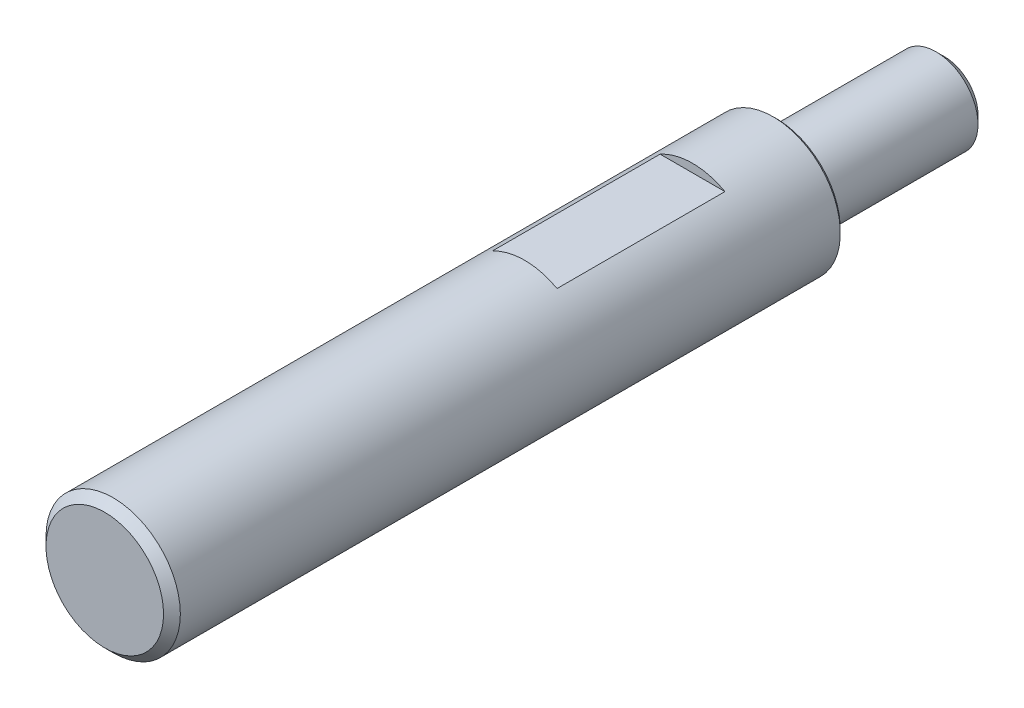
ISO-10303-21;
HEADER;
FILE_DESCRIPTION(('STEP AP214'),'2;1');
FILE_NAME('part.step','',(''),(''),'','','');
FILE_SCHEMA(('AUTOMOTIVE_DESIGN { 1 0 10303 214 1 1 1 1 }'));
ENDSEC;
DATA;
#1=APPLICATION_CONTEXT('core data for automotive mechanical design processes');
#2=APPLICATION_PROTOCOL_DEFINITION('international standard','automotive_design',2000,#1);
#3=PRODUCT_CONTEXT('',#1,'mechanical');
#4=PRODUCT('Part','Part','',(#3));
#5=PRODUCT_RELATED_PRODUCT_CATEGORY('part','',(#4));
#6=PRODUCT_DEFINITION_FORMATION('','',#4);
#7=PRODUCT_DEFINITION_CONTEXT('part definition',#1,'design');
#8=PRODUCT_DEFINITION('design','',#6,#7);
#9=PRODUCT_DEFINITION_SHAPE('','',#8);
#10=(LENGTH_UNIT() NAMED_UNIT(*) SI_UNIT(.MILLI.,.METRE.));
#11=(NAMED_UNIT(*) PLANE_ANGLE_UNIT() SI_UNIT($,.RADIAN.));
#12=(NAMED_UNIT(*) SI_UNIT($,.STERADIAN.) SOLID_ANGLE_UNIT());
#13=UNCERTAINTY_MEASURE_WITH_UNIT(LENGTH_MEASURE(1.E-05),#10,'distance_accuracy_value','');
#14=(GEOMETRIC_REPRESENTATION_CONTEXT(3) GLOBAL_UNCERTAINTY_ASSIGNED_CONTEXT((#13)) GLOBAL_UNIT_ASSIGNED_CONTEXT((#10,
#11,#12)) REPRESENTATION_CONTEXT('',''));
#15=CARTESIAN_POINT('',(0.,0.,0.));
#16=DIRECTION('',(0.,0.,1.));
#17=DIRECTION('',(1.,0.,0.));
#18=AXIS2_PLACEMENT_3D('',#15,#16,#17);
#19=CARTESIAN_POINT('',(0.,0.,25.));
#20=DIRECTION('',(0.,0.,-1.));
#21=DIRECTION('',(-1.,0.,0.));
#22=AXIS2_PLACEMENT_3D('',#19,#20,#21);
#23=CYLINDRICAL_SURFACE('',#22,4.);
#24=CARTESIAN_POINT('',(0.,0.,24.5));
#25=DIRECTION('',(0.,0.,1.));
#26=DIRECTION('',(1.,0.,0.));
#27=AXIS2_PLACEMENT_3D('',#24,#25,#26);
#28=CIRCLE('',#27,4.);
#29=CARTESIAN_POINT('',(4.,0.,24.5));
#30=VERTEX_POINT('',#29);
#31=EDGE_CURVE('E11',#30,#30,#28,.F.);
#32=ORIENTED_EDGE('',*,*,#31,.T.);
#33=EDGE_LOOP('',(#32));
#34=FACE_BOUND('',#33,.T.);
#35=DIRECTION('',(0.,0.,-1.));
#36=VECTOR('',#35,1.);
#37=CARTESIAN_POINT('',(1.94150366114404,-3.49722225970331,25.));
#38=LINE('',#37,#36);
#39=CARTESIAN_POINT('',(1.94150366114404,-3.49722225970331,0.));
#40=VERTEX_POINT('',#39);
#41=CARTESIAN_POINT('',(1.94150366114404,-3.49722225970331,-10.));
#42=VERTEX_POINT('',#41);
#43=EDGE_CURVE('E87',#40,#42,#38,.T.);
#44=ORIENTED_EDGE('',*,*,#43,.T.);
#45=CARTESIAN_POINT('',(0.,0.,-10.));
#46=DIRECTION('',(0.,0.,-1.));
#47=DIRECTION('',(-1.,0.,0.));
#48=AXIS2_PLACEMENT_3D('',#45,#46,#47);
#49=CIRCLE('',#48,4.);
#50=CARTESIAN_POINT('',(-1.94150366114404,-3.49722225970331,-10.));
#51=VERTEX_POINT('',#50);
#52=EDGE_CURVE('E75',#42,#51,#49,.T.);
#53=ORIENTED_EDGE('',*,*,#52,.T.);
#54=DIRECTION('',(0.,0.,-1.));
#55=VECTOR('',#54,1.);
#56=CARTESIAN_POINT('',(-1.94150366114404,-3.49722225970331,25.));
#57=LINE('',#56,#55);
#58=CARTESIAN_POINT('',(-1.94150366114404,-3.49722225970331,0.));
#59=VERTEX_POINT('',#58);
#60=EDGE_CURVE('E80',#51,#59,#57,.F.);
#61=ORIENTED_EDGE('',*,*,#60,.T.);
#62=CARTESIAN_POINT('',(0.,0.,0.));
#63=DIRECTION('',(0.,0.,1.));
#64=DIRECTION('',(0.,-1.,0.));
#65=AXIS2_PLACEMENT_3D('',#62,#63,#64);
#66=CIRCLE('',#65,4.);
#67=EDGE_CURVE('E92',#59,#40,#66,.T.);
#68=ORIENTED_EDGE('',*,*,#67,.T.);
#69=EDGE_LOOP('',(#44,#53,#61,#68));
#70=FACE_BOUND('',#69,.T.);
#71=CARTESIAN_POINT('',(0.,0.,0.));
#72=DIRECTION('',(0.,0.,1.));
#73=DIRECTION('',(0.,-1.,0.));
#74=AXIS2_PLACEMENT_3D('',#71,#72,#73);
#75=CIRCLE('',#74,4.);
#76=CARTESIAN_POINT('',(1.93146268462064,3.50277774029669,0.));
#77=VERTEX_POINT('',#76);
#78=CARTESIAN_POINT('',(-1.93146268462064,3.50277774029669,0.));
#79=VERTEX_POINT('',#78);
#80=EDGE_CURVE('E100',#77,#79,#75,.T.);
#81=ORIENTED_EDGE('',*,*,#80,.T.);
#82=DIRECTION('',(0.,0.,-1.));
#83=VECTOR('',#82,1.);
#84=CARTESIAN_POINT('',(-1.93146268462064,3.50277774029669,25.));
#85=LINE('',#84,#83);
#86=CARTESIAN_POINT('',(-1.93146268462064,3.50277774029669,-10.));
#87=VERTEX_POINT('',#86);
#88=EDGE_CURVE('E81',#79,#87,#85,.T.);
#89=ORIENTED_EDGE('',*,*,#88,.T.);
#90=CARTESIAN_POINT('',(0.,0.,-10.));
#91=DIRECTION('',(0.,0.,-1.));
#92=DIRECTION('',(-1.,0.,0.));
#93=AXIS2_PLACEMENT_3D('',#90,#91,#92);
#94=CIRCLE('',#93,4.);
#95=CARTESIAN_POINT('',(1.93146268462064,3.50277774029669,-10.));
#96=VERTEX_POINT('',#95);
#97=EDGE_CURVE('E103',#87,#96,#94,.T.);
#98=ORIENTED_EDGE('',*,*,#97,.T.);
#99=DIRECTION('',(0.,0.,-1.));
#100=VECTOR('',#99,1.);
#101=CARTESIAN_POINT('',(1.93146268462064,3.50277774029669,25.));
#102=LINE('',#101,#100);
#103=EDGE_CURVE('E106',#96,#77,#102,.F.);
#104=ORIENTED_EDGE('',*,*,#103,.T.);
#105=EDGE_LOOP('',(#81,#89,#98,#104));
#106=FACE_BOUND('',#105,.T.);
#107=CARTESIAN_POINT('',(0.,0.,-14.8));
#108=DIRECTION('',(0.,0.,-1.));
#109=DIRECTION('',(-1.,0.,0.));
#110=AXIS2_PLACEMENT_3D('',#107,#108,#109);
#111=CIRCLE('',#110,4.);
#112=CARTESIAN_POINT('',(-4.,0.,-14.8));
#113=VERTEX_POINT('',#112);
#114=EDGE_CURVE('E109',#113,#113,#111,.F.);
#115=ORIENTED_EDGE('',*,*,#114,.T.);
#116=EDGE_LOOP('',(#115));
#117=FACE_BOUND('',#116,.T.);
#118=ADVANCED_FACE('F36',(#34,#70,#106,#117),#23,.T.);
#119=CARTESIAN_POINT('',(0.,0.,25.));
#120=DIRECTION('',(0.,0.,1.));
#121=DIRECTION('',(1.,0.,0.));
#122=AXIS2_PLACEMENT_3D('',#119,#120,#121);
#123=PLANE('',#122);
#124=CARTESIAN_POINT('',(0.,0.,25.));
#125=DIRECTION('',(0.,0.,1.));
#126=DIRECTION('',(1.,0.,0.));
#127=AXIS2_PLACEMENT_3D('',#124,#125,#126);
#128=CIRCLE('',#127,3.49999999999999);
#129=CARTESIAN_POINT('',(3.49999999999999,0.,25.));
#130=VERTEX_POINT('',#129);
#131=EDGE_CURVE('E44',#130,#130,#128,.T.);
#132=ORIENTED_EDGE('',*,*,#131,.T.);
#133=EDGE_LOOP('',(#132));
#134=FACE_BOUND('',#133,.T.);
#135=ADVANCED_FACE('F143',(#134),#123,.T.);
#136=CARTESIAN_POINT('',(0.,0.,-15.));
#137=DIRECTION('',(0.,0.,-1.));
#138=DIRECTION('',(-1.,0.,0.));
#139=AXIS2_PLACEMENT_3D('',#136,#137,#138);
#140=PLANE('',#139);
#141=CARTESIAN_POINT('',(0.,0.,-15.));
#142=DIRECTION('',(0.,0.,-1.));
#143=DIRECTION('',(-1.,0.,0.));
#144=AXIS2_PLACEMENT_3D('',#141,#142,#143);
#145=CIRCLE('',#144,3.8);
#146=CARTESIAN_POINT('',(-3.8,0.,-15.));
#147=VERTEX_POINT('',#146);
#148=EDGE_CURVE('E112',#147,#147,#145,.T.);
#149=ORIENTED_EDGE('',*,*,#148,.T.);
#150=EDGE_LOOP('',(#149));
#151=FACE_BOUND('',#150,.T.);
#152=CARTESIAN_POINT('',(0.,0.,-15.));
#153=DIRECTION('',(0.,0.,-1.));
#154=DIRECTION('',(-1.,0.,0.));
#155=AXIS2_PLACEMENT_3D('',#152,#153,#154);
#156=CIRCLE('',#155,2.5);
#157=CARTESIAN_POINT('',(-2.5,0.,-15.));
#158=VERTEX_POINT('',#157);
#159=EDGE_CURVE('E121',#158,#158,#156,.T.);
#160=ORIENTED_EDGE('',*,*,#159,.F.);
#161=EDGE_LOOP('',(#160));
#162=FACE_BOUND('',#161,.T.);
#163=ADVANCED_FACE('F149',(#151,#162),#140,.T.);
#164=CARTESIAN_POINT('',(0.,0.,-15.));
#165=DIRECTION('',(0.,0.,-1.));
#166=DIRECTION('',(-1.,0.,0.));
#167=AXIS2_PLACEMENT_3D('',#164,#165,#166);
#168=CYLINDRICAL_SURFACE('',#167,2.5);
#169=CARTESIAN_POINT('',(0.,0.,-24.5));
#170=DIRECTION('',(0.,0.,1.));
#171=DIRECTION('',(1.,0.,0.));
#172=AXIS2_PLACEMENT_3D('',#169,#170,#171);
#173=CIRCLE('',#172,2.5);
#174=CARTESIAN_POINT('',(2.5,0.,-24.5));
#175=VERTEX_POINT('',#174);
#176=EDGE_CURVE('E115',#175,#175,#173,.T.);
#177=ORIENTED_EDGE('',*,*,#176,.T.);
#178=EDGE_LOOP('',(#177));
#179=FACE_BOUND('',#178,.T.);
#180=ORIENTED_EDGE('',*,*,#159,.T.);
#181=EDGE_LOOP('',(#180));
#182=FACE_BOUND('',#181,.T.);
#183=ADVANCED_FACE('F173',(#179,#182),#168,.T.);
#184=CARTESIAN_POINT('',(0.,0.,-25.));
#185=DIRECTION('',(0.,0.,1.));
#186=DIRECTION('',(1.,0.,0.));
#187=AXIS2_PLACEMENT_3D('',#184,#185,#186);
#188=PLANE('',#187);
#189=CARTESIAN_POINT('',(0.,0.,-25.));
#190=DIRECTION('',(0.,0.,1.));
#191=DIRECTION('',(1.,0.,0.));
#192=AXIS2_PLACEMENT_3D('',#189,#190,#191);
#193=CIRCLE('',#192,1.99999999999999);
#194=CARTESIAN_POINT('',(1.99999999999999,0.,-25.));
#195=VERTEX_POINT('',#194);
#196=EDGE_CURVE('E118',#195,#195,#193,.F.);
#197=ORIENTED_EDGE('',*,*,#196,.T.);
#198=EDGE_LOOP('',(#197));
#199=FACE_BOUND('',#198,.T.);
#200=ADVANCED_FACE('F154',(#199),#188,.F.);
#201=CARTESIAN_POINT('',(0.,0.,-25.));
#202=DIRECTION('',(0.,0.,1.));
#203=DIRECTION('',(1.,0.,0.));
#204=AXIS2_PLACEMENT_3D('',#201,#202,#203);
#205=CONICAL_SURFACE('',#204,1.99999999999999,0.785398163397446);
#206=ORIENTED_EDGE('',*,*,#176,.F.);
#207=EDGE_LOOP('',(#206));
#208=FACE_BOUND('',#207,.T.);
#209=ORIENTED_EDGE('',*,*,#196,.F.);
#210=EDGE_LOOP('',(#209));
#211=FACE_BOUND('',#210,.T.);
#212=ADVANCED_FACE('F155',(#208,#211),#205,.T.);
#213=CARTESIAN_POINT('',(0.,0.,-15.));
#214=DIRECTION('',(0.,0.,1.));
#215=DIRECTION('',(1.,0.,0.));
#216=AXIS2_PLACEMENT_3D('',#213,#214,#215);
#217=CONICAL_SURFACE('',#216,3.8,0.785398163397457);
#218=ORIENTED_EDGE('',*,*,#114,.F.);
#219=EDGE_LOOP('',(#218));
#220=FACE_BOUND('',#219,.T.);
#221=ORIENTED_EDGE('',*,*,#148,.F.);
#222=EDGE_LOOP('',(#221));
#223=FACE_BOUND('',#222,.T.);
#224=ADVANCED_FACE('F157',(#220,#223),#217,.T.);
#225=CARTESIAN_POINT('',(-5.,4.00555548059339,0.));
#226=DIRECTION('',(0.,0.,1.));
#227=DIRECTION('',(0.,-1.,0.));
#228=AXIS2_PLACEMENT_3D('',#225,#226,#227);
#229=PLANE('',#228);
#230=DIRECTION('',(1.,0.,0.));
#231=VECTOR('',#230,1.);
#232=CARTESIAN_POINT('',(-5.,3.50277774029669,0.));
#233=LINE('',#232,#231);
#234=EDGE_CURVE('E58',#79,#77,#233,.T.);
#235=ORIENTED_EDGE('',*,*,#234,.F.);
#236=ORIENTED_EDGE('',*,*,#80,.F.);
#237=EDGE_LOOP('',(#235,#236));
#238=FACE_BOUND('',#237,.T.);
#239=ADVANCED_FACE('F160',(#238),#229,.F.);
#240=CARTESIAN_POINT('',(-5.,4.00555548059339,-10.));
#241=DIRECTION('',(0.,0.,-1.));
#242=DIRECTION('',(-1.,0.,0.));
#243=AXIS2_PLACEMENT_3D('',#240,#241,#242);
#244=PLANE('',#243);
#245=DIRECTION('',(1.,0.,0.));
#246=VECTOR('',#245,1.);
#247=CARTESIAN_POINT('',(-5.,3.50277774029669,-10.));
#248=LINE('',#247,#246);
#249=EDGE_CURVE('E124',#87,#96,#248,.T.);
#250=ORIENTED_EDGE('',*,*,#249,.T.);
#251=ORIENTED_EDGE('',*,*,#97,.F.);
#252=EDGE_LOOP('',(#250,#251));
#253=FACE_BOUND('',#252,.T.);
#254=ADVANCED_FACE('F138',(#253),#244,.F.);
#255=CARTESIAN_POINT('',(-5.,3.50277774029669,0.));
#256=DIRECTION('',(0.,-1.,0.));
#257=DIRECTION('',(0.,0.,-1.));
#258=AXIS2_PLACEMENT_3D('',#255,#256,#257);
#259=PLANE('',#258);
#260=ORIENTED_EDGE('',*,*,#234,.T.);
#261=ORIENTED_EDGE('',*,*,#103,.F.);
#262=ORIENTED_EDGE('',*,*,#249,.F.);
#263=ORIENTED_EDGE('',*,*,#88,.F.);
#264=EDGE_LOOP('',(#260,#261,#262,#263));
#265=FACE_BOUND('',#264,.T.);
#266=ADVANCED_FACE('F131',(#265),#259,.F.);
#267=CARTESIAN_POINT('',(-5.,-4.,0.));
#268=DIRECTION('',(0.,0.,1.));
#269=DIRECTION('',(0.,-1.,0.));
#270=AXIS2_PLACEMENT_3D('',#267,#268,#269);
#271=PLANE('',#270);
#272=ORIENTED_EDGE('',*,*,#67,.F.);
#273=DIRECTION('',(1.,0.,0.));
#274=VECTOR('',#273,1.);
#275=CARTESIAN_POINT('',(-5.,-3.49722225970331,0.));
#276=LINE('',#275,#274);
#277=EDGE_CURVE('E89',#59,#40,#276,.T.);
#278=ORIENTED_EDGE('',*,*,#277,.T.);
#279=EDGE_LOOP('',(#272,#278));
#280=FACE_BOUND('',#279,.T.);
#281=ADVANCED_FACE('F129',(#280),#271,.F.);
#282=CARTESIAN_POINT('',(-5.,-3.49722225970331,0.));
#283=DIRECTION('',(0.,1.,0.));
#284=DIRECTION('',(0.,0.,1.));
#285=AXIS2_PLACEMENT_3D('',#282,#283,#284);
#286=PLANE('',#285);
#287=ORIENTED_EDGE('',*,*,#277,.F.);
#288=ORIENTED_EDGE('',*,*,#60,.F.);
#289=DIRECTION('',(1.,0.,0.));
#290=VECTOR('',#289,1.);
#291=CARTESIAN_POINT('',(-5.,-3.49722225970331,-10.));
#292=LINE('',#291,#290);
#293=EDGE_CURVE('E50',#51,#42,#292,.T.);
#294=ORIENTED_EDGE('',*,*,#293,.T.);
#295=ORIENTED_EDGE('',*,*,#43,.F.);
#296=EDGE_LOOP('',(#287,#288,#294,#295));
#297=FACE_BOUND('',#296,.T.);
#298=ADVANCED_FACE('F86',(#297),#286,.F.);
#299=CARTESIAN_POINT('',(-5.,-4.,-10.));
#300=DIRECTION('',(0.,0.,-1.));
#301=DIRECTION('',(-1.,0.,0.));
#302=AXIS2_PLACEMENT_3D('',#299,#300,#301);
#303=PLANE('',#302);
#304=ORIENTED_EDGE('',*,*,#293,.F.);
#305=ORIENTED_EDGE('',*,*,#52,.F.);
#306=EDGE_LOOP('',(#304,#305));
#307=FACE_BOUND('',#306,.T.);
#308=ADVANCED_FACE('F76',(#307),#303,.F.);
#309=CARTESIAN_POINT('',(0.,0.,25.));
#310=DIRECTION('',(0.,0.,-1.));
#311=DIRECTION('',(-1.,0.,0.));
#312=AXIS2_PLACEMENT_3D('',#309,#310,#311);
#313=CONICAL_SURFACE('',#312,3.49999999999999,0.785398163397448);
#314=ORIENTED_EDGE('',*,*,#31,.F.);
#315=EDGE_LOOP('',(#314));
#316=FACE_BOUND('',#315,.T.);
#317=ORIENTED_EDGE('',*,*,#131,.F.);
#318=EDGE_LOOP('',(#317));
#319=FACE_BOUND('',#318,.T.);
#320=ADVANCED_FACE('F38',(#316,#319),#313,.T.);
#321=CLOSED_SHELL('',(#118,#135,#163,#183,#200,#212,#224,#239,#254,#266,#281,#298,#308,#320));
#322=MANIFOLD_SOLID_BREP('B2',#321);
#323=ADVANCED_BREP_SHAPE_REPRESENTATION('',(#18,#322),#14);
#324=SHAPE_DEFINITION_REPRESENTATION(#9,#323);
ENDSEC;
END-ISO-10303-21;
